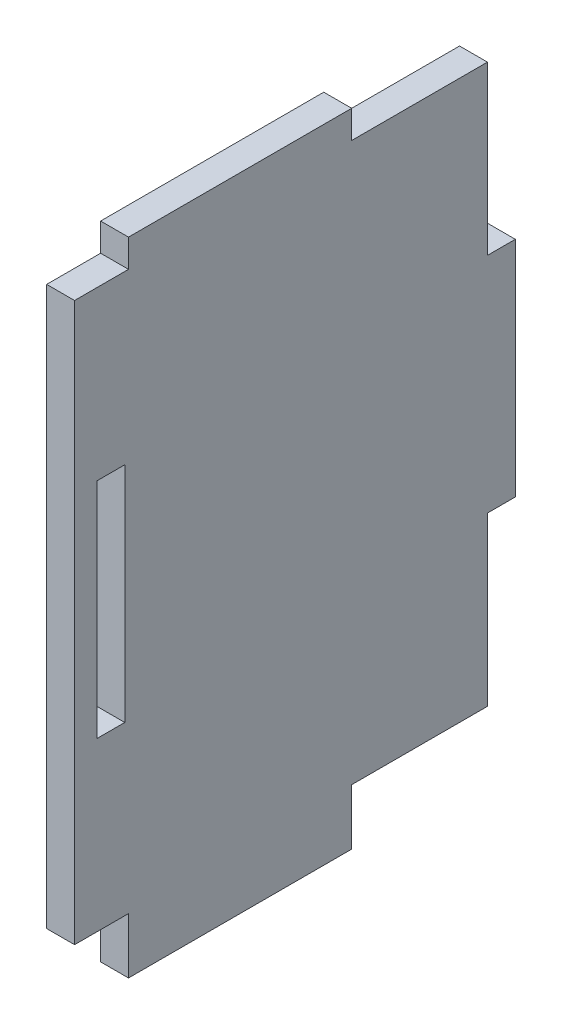
ISO-10303-21;
HEADER;
FILE_DESCRIPTION(('STEP AP214'),'2;1');
FILE_NAME('part.step','',(''),(''),'','','');
FILE_SCHEMA(('AUTOMOTIVE_DESIGN { 1 0 10303 214 1 1 1 1 }'));
ENDSEC;
DATA;
#1=APPLICATION_CONTEXT('core data for automotive mechanical design processes');
#2=APPLICATION_PROTOCOL_DEFINITION('international standard','automotive_design',2000,#1);
#3=PRODUCT_CONTEXT('',#1,'mechanical');
#4=PRODUCT('Part','Part','',(#3));
#5=PRODUCT_RELATED_PRODUCT_CATEGORY('part','',(#4));
#6=PRODUCT_DEFINITION_FORMATION('','',#4);
#7=PRODUCT_DEFINITION_CONTEXT('part definition',#1,'design');
#8=PRODUCT_DEFINITION('design','',#6,#7);
#9=PRODUCT_DEFINITION_SHAPE('','',#8);
#10=(LENGTH_UNIT() NAMED_UNIT(*) SI_UNIT(.MILLI.,.METRE.));
#11=(NAMED_UNIT(*) PLANE_ANGLE_UNIT() SI_UNIT($,.RADIAN.));
#12=(NAMED_UNIT(*) SI_UNIT($,.STERADIAN.) SOLID_ANGLE_UNIT());
#13=UNCERTAINTY_MEASURE_WITH_UNIT(LENGTH_MEASURE(1.E-05),#10,'distance_accuracy_value','');
#14=(GEOMETRIC_REPRESENTATION_CONTEXT(3) GLOBAL_UNCERTAINTY_ASSIGNED_CONTEXT((#13)) GLOBAL_UNIT_ASSIGNED_CONTEXT((#10,
#11,#12)) REPRESENTATION_CONTEXT('',''));
#15=CARTESIAN_POINT('',(0.,0.,0.));
#16=DIRECTION('',(0.,0.,1.));
#17=DIRECTION('',(1.,0.,0.));
#18=AXIS2_PLACEMENT_3D('',#15,#16,#17);
#19=CARTESIAN_POINT('',(1.25,0.,-4.83333333333335));
#20=DIRECTION('',(0.,0.,-1.));
#21=DIRECTION('',(0.,1.,0.));
#22=AXIS2_PLACEMENT_3D('',#19,#20,#21);
#23=PLANE('',#22);
#24=DIRECTION('',(0.,-1.,0.));
#25=VECTOR('',#24,1.);
#26=CARTESIAN_POINT('',(-1.25,0.,-4.83333333333335));
#27=LINE('',#26,#25);
#28=CARTESIAN_POINT('',(-1.25,5.,-4.83333333333335));
#29=VERTEX_POINT('',#28);
#30=CARTESIAN_POINT('',(-1.25,0.,-4.83333333333335));
#31=VERTEX_POINT('',#30);
#32=EDGE_CURVE('E222',#29,#31,#27,.T.);
#33=ORIENTED_EDGE('',*,*,#32,.T.);
#34=DIRECTION('',(-1.,0.,0.));
#35=VECTOR('',#34,1.);
#36=CARTESIAN_POINT('',(1.25,0.,-4.83333333333335));
#37=LINE('',#36,#35);
#38=CARTESIAN_POINT('',(1.25,0.,-4.83333333333335));
#39=VERTEX_POINT('',#38);
#40=EDGE_CURVE('E11',#39,#31,#37,.T.);
#41=ORIENTED_EDGE('',*,*,#40,.F.);
#42=DIRECTION('',(0.,-1.,0.));
#43=VECTOR('',#42,1.);
#44=CARTESIAN_POINT('',(1.25,0.,-4.83333333333335));
#45=LINE('',#44,#43);
#46=CARTESIAN_POINT('',(1.25,5.,-4.83333333333335));
#47=VERTEX_POINT('',#46);
#48=EDGE_CURVE('E392',#47,#39,#45,.T.);
#49=ORIENTED_EDGE('',*,*,#48,.F.);
#50=DIRECTION('',(-1.,0.,0.));
#51=VECTOR('',#50,1.);
#52=CARTESIAN_POINT('',(1.25,5.,-4.83333333333335));
#53=LINE('',#52,#51);
#54=EDGE_CURVE('E54',#47,#29,#53,.T.);
#55=ORIENTED_EDGE('',*,*,#54,.T.);
#56=EDGE_LOOP('',(#33,#41,#49,#55));
#57=FACE_BOUND('',#56,.T.);
#58=ADVANCED_FACE('F35',(#57),#23,.F.);
#59=CARTESIAN_POINT('',(1.25,0.,0.));
#60=DIRECTION('',(0.,1.,0.));
#61=DIRECTION('',(0.,0.,1.));
#62=AXIS2_PLACEMENT_3D('',#59,#60,#61);
#63=PLANE('',#62);
#64=DIRECTION('',(0.,0.,-1.));
#65=VECTOR('',#64,1.);
#66=CARTESIAN_POINT('',(-1.25,0.,0.));
#67=LINE('',#66,#65);
#68=CARTESIAN_POINT('',(-1.25,0.,-24.8333333333334));
#69=VERTEX_POINT('',#68);
#70=EDGE_CURVE('E224',#31,#69,#67,.T.);
#71=ORIENTED_EDGE('',*,*,#70,.T.);
#72=DIRECTION('',(-1.,0.,0.));
#73=VECTOR('',#72,1.);
#74=CARTESIAN_POINT('',(1.25,0.,-24.8333333333334));
#75=LINE('',#74,#73);
#76=CARTESIAN_POINT('',(1.25,0.,-24.8333333333334));
#77=VERTEX_POINT('',#76);
#78=EDGE_CURVE('E45',#77,#69,#75,.T.);
#79=ORIENTED_EDGE('',*,*,#78,.F.);
#80=DIRECTION('',(0.,0.,-1.));
#81=VECTOR('',#80,1.);
#82=CARTESIAN_POINT('',(1.25,0.,0.));
#83=LINE('',#82,#81);
#84=EDGE_CURVE('E394',#39,#77,#83,.T.);
#85=ORIENTED_EDGE('',*,*,#84,.F.);
#86=ORIENTED_EDGE('',*,*,#40,.T.);
#87=EDGE_LOOP('',(#71,#79,#85,#86));
#88=FACE_BOUND('',#87,.T.);
#89=ADVANCED_FACE('F322',(#88),#63,.F.);
#90=CARTESIAN_POINT('',(1.25,0.,-24.8333333333334));
#91=DIRECTION('',(0.,0.,1.));
#92=DIRECTION('',(1.,0.,0.));
#93=AXIS2_PLACEMENT_3D('',#90,#91,#92);
#94=PLANE('',#93);
#95=DIRECTION('',(0.,1.,0.));
#96=VECTOR('',#95,1.);
#97=CARTESIAN_POINT('',(-1.25,0.,-24.8333333333334));
#98=LINE('',#97,#96);
#99=CARTESIAN_POINT('',(-1.25,5.,-24.8333333333334));
#100=VERTEX_POINT('',#99);
#101=EDGE_CURVE('E226',#69,#100,#98,.T.);
#102=ORIENTED_EDGE('',*,*,#101,.T.);
#103=DIRECTION('',(-1.,0.,0.));
#104=VECTOR('',#103,1.);
#105=CARTESIAN_POINT('',(1.25,5.,-24.8333333333334));
#106=LINE('',#105,#104);
#107=CARTESIAN_POINT('',(1.25,5.,-24.8333333333334));
#108=VERTEX_POINT('',#107);
#109=EDGE_CURVE('E286',#108,#100,#106,.T.);
#110=ORIENTED_EDGE('',*,*,#109,.F.);
#111=DIRECTION('',(0.,1.,0.));
#112=VECTOR('',#111,1.);
#113=CARTESIAN_POINT('',(1.25,0.,-24.8333333333334));
#114=LINE('',#113,#112);
#115=EDGE_CURVE('E396',#77,#108,#114,.T.);
#116=ORIENTED_EDGE('',*,*,#115,.F.);
#117=ORIENTED_EDGE('',*,*,#78,.T.);
#118=EDGE_LOOP('',(#102,#110,#116,#117));
#119=FACE_BOUND('',#118,.T.);
#120=ADVANCED_FACE('F327',(#119),#94,.F.);
#121=CARTESIAN_POINT('',(1.25,5.,0.));
#122=DIRECTION('',(0.,1.,0.));
#123=DIRECTION('',(0.,0.,1.));
#124=AXIS2_PLACEMENT_3D('',#121,#122,#123);
#125=PLANE('',#124);
#126=DIRECTION('',(0.,0.,-1.));
#127=VECTOR('',#126,1.);
#128=CARTESIAN_POINT('',(-1.25,5.,0.));
#129=LINE('',#128,#127);
#130=CARTESIAN_POINT('',(-1.25,5.,-37.));
#131=VERTEX_POINT('',#130);
#132=EDGE_CURVE('E228',#100,#131,#129,.T.);
#133=ORIENTED_EDGE('',*,*,#132,.T.);
#134=DIRECTION('',(-1.,0.,0.));
#135=VECTOR('',#134,1.);
#136=CARTESIAN_POINT('',(1.25,5.,-37.));
#137=LINE('',#136,#135);
#138=CARTESIAN_POINT('',(1.25,5.,-37.));
#139=VERTEX_POINT('',#138);
#140=EDGE_CURVE('E283',#139,#131,#137,.T.);
#141=ORIENTED_EDGE('',*,*,#140,.F.);
#142=DIRECTION('',(0.,0.,-1.));
#143=VECTOR('',#142,1.);
#144=CARTESIAN_POINT('',(1.25,5.,0.));
#145=LINE('',#144,#143);
#146=EDGE_CURVE('E398',#108,#139,#145,.T.);
#147=ORIENTED_EDGE('',*,*,#146,.F.);
#148=ORIENTED_EDGE('',*,*,#109,.T.);
#149=EDGE_LOOP('',(#133,#141,#147,#148));
#150=FACE_BOUND('',#149,.T.);
#151=ADVANCED_FACE('F333',(#150),#125,.F.);
#152=CARTESIAN_POINT('',(1.25,0.,-37.));
#153=DIRECTION('',(0.,0.,1.));
#154=DIRECTION('',(1.,0.,0.));
#155=AXIS2_PLACEMENT_3D('',#152,#153,#154);
#156=PLANE('',#155);
#157=DIRECTION('',(0.,1.,0.));
#158=VECTOR('',#157,1.);
#159=CARTESIAN_POINT('',(-1.25,0.,-37.));
#160=LINE('',#159,#158);
#161=CARTESIAN_POINT('',(-1.25,20.,-37.));
#162=VERTEX_POINT('',#161);
#163=EDGE_CURVE('E230',#131,#162,#160,.T.);
#164=ORIENTED_EDGE('',*,*,#163,.T.);
#165=DIRECTION('',(-1.,0.,0.));
#166=VECTOR('',#165,1.);
#167=CARTESIAN_POINT('',(1.25,20.,-37.));
#168=LINE('',#167,#166);
#169=CARTESIAN_POINT('',(1.25,20.,-37.));
#170=VERTEX_POINT('',#169);
#171=EDGE_CURVE('E280',#170,#162,#168,.T.);
#172=ORIENTED_EDGE('',*,*,#171,.F.);
#173=DIRECTION('',(0.,1.,0.));
#174=VECTOR('',#173,1.);
#175=CARTESIAN_POINT('',(1.25,0.,-37.));
#176=LINE('',#175,#174);
#177=EDGE_CURVE('E400',#139,#170,#176,.T.);
#178=ORIENTED_EDGE('',*,*,#177,.F.);
#179=ORIENTED_EDGE('',*,*,#140,.T.);
#180=EDGE_LOOP('',(#164,#172,#178,#179));
#181=FACE_BOUND('',#180,.T.);
#182=ADVANCED_FACE('F337',(#181),#156,.F.);
#183=CARTESIAN_POINT('',(1.25,20.,0.));
#184=DIRECTION('',(0.,1.,0.));
#185=DIRECTION('',(0.,0.,1.));
#186=AXIS2_PLACEMENT_3D('',#183,#184,#185);
#187=PLANE('',#186);
#188=DIRECTION('',(0.,0.,-1.));
#189=VECTOR('',#188,1.);
#190=CARTESIAN_POINT('',(-1.25,20.,0.));
#191=LINE('',#190,#189);
#192=CARTESIAN_POINT('',(-1.25,20.,-39.5));
#193=VERTEX_POINT('',#192);
#194=EDGE_CURVE('E232',#162,#193,#191,.T.);
#195=ORIENTED_EDGE('',*,*,#194,.T.);
#196=DIRECTION('',(-1.,0.,0.));
#197=VECTOR('',#196,1.);
#198=CARTESIAN_POINT('',(1.25,20.,-39.5));
#199=LINE('',#198,#197);
#200=CARTESIAN_POINT('',(1.25,20.,-39.5));
#201=VERTEX_POINT('',#200);
#202=EDGE_CURVE('E277',#201,#193,#199,.T.);
#203=ORIENTED_EDGE('',*,*,#202,.F.);
#204=DIRECTION('',(0.,0.,-1.));
#205=VECTOR('',#204,1.);
#206=CARTESIAN_POINT('',(1.25,20.,0.));
#207=LINE('',#206,#205);
#208=EDGE_CURVE('E402',#170,#201,#207,.T.);
#209=ORIENTED_EDGE('',*,*,#208,.F.);
#210=ORIENTED_EDGE('',*,*,#171,.T.);
#211=EDGE_LOOP('',(#195,#203,#209,#210));
#212=FACE_BOUND('',#211,.T.);
#213=ADVANCED_FACE('F341',(#212),#187,.F.);
#214=CARTESIAN_POINT('',(1.25,0.,-39.5));
#215=DIRECTION('',(0.,0.,1.));
#216=DIRECTION('',(1.,0.,0.));
#217=AXIS2_PLACEMENT_3D('',#214,#215,#216);
#218=PLANE('',#217);
#219=DIRECTION('',(0.,1.,0.));
#220=VECTOR('',#219,1.);
#221=CARTESIAN_POINT('',(-1.25,0.,-39.5));
#222=LINE('',#221,#220);
#223=CARTESIAN_POINT('',(-1.25,40.,-39.5));
#224=VERTEX_POINT('',#223);
#225=EDGE_CURVE('E234',#193,#224,#222,.T.);
#226=ORIENTED_EDGE('',*,*,#225,.T.);
#227=DIRECTION('',(-1.,0.,0.));
#228=VECTOR('',#227,1.);
#229=CARTESIAN_POINT('',(1.25,40.,-39.5));
#230=LINE('',#229,#228);
#231=CARTESIAN_POINT('',(1.25,40.,-39.5));
#232=VERTEX_POINT('',#231);
#233=EDGE_CURVE('E275',#232,#224,#230,.T.);
#234=ORIENTED_EDGE('',*,*,#233,.F.);
#235=DIRECTION('',(0.,1.,0.));
#236=VECTOR('',#235,1.);
#237=CARTESIAN_POINT('',(1.25,0.,-39.5));
#238=LINE('',#237,#236);
#239=EDGE_CURVE('E404',#201,#232,#238,.T.);
#240=ORIENTED_EDGE('',*,*,#239,.F.);
#241=ORIENTED_EDGE('',*,*,#202,.T.);
#242=EDGE_LOOP('',(#226,#234,#240,#241));
#243=FACE_BOUND('',#242,.T.);
#244=ADVANCED_FACE('F345',(#243),#218,.F.);
#245=CARTESIAN_POINT('',(1.25,40.,0.));
#246=DIRECTION('',(0.,1.,0.));
#247=DIRECTION('',(0.,0.,1.));
#248=AXIS2_PLACEMENT_3D('',#245,#246,#247);
#249=PLANE('',#248);
#250=DIRECTION('',(0.,0.,-1.));
#251=VECTOR('',#250,1.);
#252=CARTESIAN_POINT('',(-1.25,40.,0.));
#253=LINE('',#252,#251);
#254=CARTESIAN_POINT('',(-1.25,40.,-37.));
#255=VERTEX_POINT('',#254);
#256=EDGE_CURVE('E237',#255,#224,#253,.T.);
#257=ORIENTED_EDGE('',*,*,#256,.F.);
#258=DIRECTION('',(-1.,0.,0.));
#259=VECTOR('',#258,1.);
#260=CARTESIAN_POINT('',(1.25,40.,-37.));
#261=LINE('',#260,#259);
#262=CARTESIAN_POINT('',(1.25,40.,-37.));
#263=VERTEX_POINT('',#262);
#264=EDGE_CURVE('E273',#263,#255,#261,.T.);
#265=ORIENTED_EDGE('',*,*,#264,.F.);
#266=DIRECTION('',(0.,0.,-1.));
#267=VECTOR('',#266,1.);
#268=CARTESIAN_POINT('',(1.25,40.,0.));
#269=LINE('',#268,#267);
#270=EDGE_CURVE('E406',#263,#232,#269,.T.);
#271=ORIENTED_EDGE('',*,*,#270,.T.);
#272=ORIENTED_EDGE('',*,*,#233,.T.);
#273=EDGE_LOOP('',(#257,#265,#271,#272));
#274=FACE_BOUND('',#273,.T.);
#275=ADVANCED_FACE('F349',(#274),#249,.T.);
#276=CARTESIAN_POINT('',(1.25,0.,-37.));
#277=DIRECTION('',(0.,0.,-1.));
#278=DIRECTION('',(-1.,0.,0.));
#279=AXIS2_PLACEMENT_3D('',#276,#277,#278);
#280=PLANE('',#279);
#281=DIRECTION('',(0.,-1.,0.));
#282=VECTOR('',#281,1.);
#283=CARTESIAN_POINT('',(-1.25,0.,-37.));
#284=LINE('',#283,#282);
#285=CARTESIAN_POINT('',(-1.25,55.,-37.));
#286=VERTEX_POINT('',#285);
#287=EDGE_CURVE('E240',#286,#255,#284,.T.);
#288=ORIENTED_EDGE('',*,*,#287,.F.);
#289=DIRECTION('',(-1.,0.,0.));
#290=VECTOR('',#289,1.);
#291=CARTESIAN_POINT('',(1.25,55.,-37.));
#292=LINE('',#291,#290);
#293=CARTESIAN_POINT('',(1.25,55.,-37.));
#294=VERTEX_POINT('',#293);
#295=EDGE_CURVE('E271',#294,#286,#292,.T.);
#296=ORIENTED_EDGE('',*,*,#295,.F.);
#297=DIRECTION('',(0.,-1.,0.));
#298=VECTOR('',#297,1.);
#299=CARTESIAN_POINT('',(1.25,0.,-37.));
#300=LINE('',#299,#298);
#301=EDGE_CURVE('E409',#294,#263,#300,.T.);
#302=ORIENTED_EDGE('',*,*,#301,.T.);
#303=ORIENTED_EDGE('',*,*,#264,.T.);
#304=EDGE_LOOP('',(#288,#296,#302,#303));
#305=FACE_BOUND('',#304,.T.);
#306=ADVANCED_FACE('F353',(#305),#280,.T.);
#307=CARTESIAN_POINT('',(1.25,55.,0.));
#308=DIRECTION('',(0.,1.,0.));
#309=DIRECTION('',(0.,0.,1.));
#310=AXIS2_PLACEMENT_3D('',#307,#308,#309);
#311=PLANE('',#310);
#312=DIRECTION('',(0.,0.,-1.));
#313=VECTOR('',#312,1.);
#314=CARTESIAN_POINT('',(-1.25,55.,0.));
#315=LINE('',#314,#313);
#316=CARTESIAN_POINT('',(-1.25,55.,-24.8333333333334));
#317=VERTEX_POINT('',#316);
#318=EDGE_CURVE('E243',#317,#286,#315,.T.);
#319=ORIENTED_EDGE('',*,*,#318,.F.);
#320=DIRECTION('',(-1.,0.,0.));
#321=VECTOR('',#320,1.);
#322=CARTESIAN_POINT('',(1.25,55.,-24.8333333333334));
#323=LINE('',#322,#321);
#324=CARTESIAN_POINT('',(1.25,55.,-24.8333333333334));
#325=VERTEX_POINT('',#324);
#326=EDGE_CURVE('E269',#325,#317,#323,.T.);
#327=ORIENTED_EDGE('',*,*,#326,.F.);
#328=DIRECTION('',(0.,0.,-1.));
#329=VECTOR('',#328,1.);
#330=CARTESIAN_POINT('',(1.25,55.,0.));
#331=LINE('',#330,#329);
#332=EDGE_CURVE('E412',#325,#294,#331,.T.);
#333=ORIENTED_EDGE('',*,*,#332,.T.);
#334=ORIENTED_EDGE('',*,*,#295,.T.);
#335=EDGE_LOOP('',(#319,#327,#333,#334));
#336=FACE_BOUND('',#335,.T.);
#337=ADVANCED_FACE('F357',(#336),#311,.T.);
#338=CARTESIAN_POINT('',(1.25,0.,-24.8333333333334));
#339=DIRECTION('',(0.,0.,-1.));
#340=DIRECTION('',(-1.,0.,0.));
#341=AXIS2_PLACEMENT_3D('',#338,#339,#340);
#342=PLANE('',#341);
#343=DIRECTION('',(0.,-1.,0.));
#344=VECTOR('',#343,1.);
#345=CARTESIAN_POINT('',(-1.25,0.,-24.8333333333334));
#346=LINE('',#345,#344);
#347=CARTESIAN_POINT('',(-1.25,57.5,-24.8333333333334));
#348=VERTEX_POINT('',#347);
#349=EDGE_CURVE('E246',#348,#317,#346,.T.);
#350=ORIENTED_EDGE('',*,*,#349,.F.);
#351=DIRECTION('',(-1.,0.,0.));
#352=VECTOR('',#351,1.);
#353=CARTESIAN_POINT('',(1.25,57.5,-24.8333333333334));
#354=LINE('',#353,#352);
#355=CARTESIAN_POINT('',(1.25,57.5,-24.8333333333334));
#356=VERTEX_POINT('',#355);
#357=EDGE_CURVE('E267',#356,#348,#354,.T.);
#358=ORIENTED_EDGE('',*,*,#357,.F.);
#359=DIRECTION('',(0.,-1.,0.));
#360=VECTOR('',#359,1.);
#361=CARTESIAN_POINT('',(1.25,0.,-24.8333333333334));
#362=LINE('',#361,#360);
#363=EDGE_CURVE('E415',#356,#325,#362,.T.);
#364=ORIENTED_EDGE('',*,*,#363,.T.);
#365=ORIENTED_EDGE('',*,*,#326,.T.);
#366=EDGE_LOOP('',(#350,#358,#364,#365));
#367=FACE_BOUND('',#366,.T.);
#368=ADVANCED_FACE('F361',(#367),#342,.T.);
#369=CARTESIAN_POINT('',(1.25,57.5,0.));
#370=DIRECTION('',(0.,1.,0.));
#371=DIRECTION('',(0.,0.,1.));
#372=AXIS2_PLACEMENT_3D('',#369,#370,#371);
#373=PLANE('',#372);
#374=DIRECTION('',(0.,0.,-1.));
#375=VECTOR('',#374,1.);
#376=CARTESIAN_POINT('',(-1.25,57.5,0.));
#377=LINE('',#376,#375);
#378=CARTESIAN_POINT('',(-1.25,57.5,-4.83333333333334));
#379=VERTEX_POINT('',#378);
#380=EDGE_CURVE('E249',#379,#348,#377,.T.);
#381=ORIENTED_EDGE('',*,*,#380,.F.);
#382=DIRECTION('',(-1.,0.,0.));
#383=VECTOR('',#382,1.);
#384=CARTESIAN_POINT('',(1.25,57.5,-4.83333333333334));
#385=LINE('',#384,#383);
#386=CARTESIAN_POINT('',(1.25,57.5,-4.83333333333334));
#387=VERTEX_POINT('',#386);
#388=EDGE_CURVE('E265',#387,#379,#385,.T.);
#389=ORIENTED_EDGE('',*,*,#388,.F.);
#390=DIRECTION('',(0.,0.,-1.));
#391=VECTOR('',#390,1.);
#392=CARTESIAN_POINT('',(1.25,57.5,0.));
#393=LINE('',#392,#391);
#394=EDGE_CURVE('E418',#387,#356,#393,.T.);
#395=ORIENTED_EDGE('',*,*,#394,.T.);
#396=ORIENTED_EDGE('',*,*,#357,.T.);
#397=EDGE_LOOP('',(#381,#389,#395,#396));
#398=FACE_BOUND('',#397,.T.);
#399=ADVANCED_FACE('F365',(#398),#373,.T.);
#400=CARTESIAN_POINT('',(1.25,0.,-4.83333333333334));
#401=DIRECTION('',(0.,0.,1.));
#402=DIRECTION('',(1.,0.,0.));
#403=AXIS2_PLACEMENT_3D('',#400,#401,#402);
#404=PLANE('',#403);
#405=DIRECTION('',(0.,1.,0.));
#406=VECTOR('',#405,1.);
#407=CARTESIAN_POINT('',(-1.25,0.,-4.83333333333334));
#408=LINE('',#407,#406);
#409=CARTESIAN_POINT('',(-1.25,55.,-4.83333333333334));
#410=VERTEX_POINT('',#409);
#411=EDGE_CURVE('E252',#410,#379,#408,.T.);
#412=ORIENTED_EDGE('',*,*,#411,.F.);
#413=DIRECTION('',(-1.,0.,0.));
#414=VECTOR('',#413,1.);
#415=CARTESIAN_POINT('',(1.25,55.,-4.83333333333334));
#416=LINE('',#415,#414);
#417=CARTESIAN_POINT('',(1.25,55.,-4.83333333333334));
#418=VERTEX_POINT('',#417);
#419=EDGE_CURVE('E201',#418,#410,#416,.T.);
#420=ORIENTED_EDGE('',*,*,#419,.F.);
#421=DIRECTION('',(0.,1.,0.));
#422=VECTOR('',#421,1.);
#423=CARTESIAN_POINT('',(1.25,0.,-4.83333333333334));
#424=LINE('',#423,#422);
#425=EDGE_CURVE('E191',#418,#387,#424,.T.);
#426=ORIENTED_EDGE('',*,*,#425,.T.);
#427=ORIENTED_EDGE('',*,*,#388,.T.);
#428=EDGE_LOOP('',(#412,#420,#426,#427));
#429=FACE_BOUND('',#428,.T.);
#430=ADVANCED_FACE('F369',(#429),#404,.T.);
#431=CARTESIAN_POINT('',(1.25,55.,0.));
#432=DIRECTION('',(0.,-1.,0.));
#433=DIRECTION('',(0.,0.,-1.));
#434=AXIS2_PLACEMENT_3D('',#431,#432,#433);
#435=PLANE('',#434);
#436=DIRECTION('',(0.,0.,1.));
#437=VECTOR('',#436,1.);
#438=CARTESIAN_POINT('',(-1.25,55.,0.));
#439=LINE('',#438,#437);
#440=CARTESIAN_POINT('',(-1.25,55.,0.));
#441=VERTEX_POINT('',#440);
#442=EDGE_CURVE('E198',#410,#441,#439,.T.);
#443=ORIENTED_EDGE('',*,*,#442,.T.);
#444=DIRECTION('',(-1.,0.,0.));
#445=VECTOR('',#444,1.);
#446=CARTESIAN_POINT('',(1.25,55.,0.));
#447=LINE('',#446,#445);
#448=CARTESIAN_POINT('',(1.25,55.,0.));
#449=VERTEX_POINT('',#448);
#450=EDGE_CURVE('E195',#449,#441,#447,.T.);
#451=ORIENTED_EDGE('',*,*,#450,.F.);
#452=DIRECTION('',(0.,0.,1.));
#453=VECTOR('',#452,1.);
#454=CARTESIAN_POINT('',(1.25,55.,0.));
#455=LINE('',#454,#453);
#456=EDGE_CURVE('E182',#418,#449,#455,.T.);
#457=ORIENTED_EDGE('',*,*,#456,.F.);
#458=ORIENTED_EDGE('',*,*,#419,.T.);
#459=EDGE_LOOP('',(#443,#451,#457,#458));
#460=FACE_BOUND('',#459,.T.);
#461=ADVANCED_FACE('F196',(#460),#435,.F.);
#462=CARTESIAN_POINT('',(1.25,0.,0.));
#463=DIRECTION('',(0.,0.,-1.));
#464=DIRECTION('',(0.,1.,0.));
#465=AXIS2_PLACEMENT_3D('',#462,#463,#464);
#466=PLANE('',#465);
#467=DIRECTION('',(0.,-1.,0.));
#468=VECTOR('',#467,1.);
#469=CARTESIAN_POINT('',(-1.25,0.,0.));
#470=LINE('',#469,#468);
#471=CARTESIAN_POINT('',(-1.25,5.,0.));
#472=VERTEX_POINT('',#471);
#473=EDGE_CURVE('E256',#441,#472,#470,.T.);
#474=ORIENTED_EDGE('',*,*,#473,.T.);
#475=DIRECTION('',(-1.,0.,0.));
#476=VECTOR('',#475,1.);
#477=CARTESIAN_POINT('',(1.25,5.,0.));
#478=LINE('',#477,#476);
#479=CARTESIAN_POINT('',(1.25,5.,0.));
#480=VERTEX_POINT('',#479);
#481=EDGE_CURVE('E117',#480,#472,#478,.T.);
#482=ORIENTED_EDGE('',*,*,#481,.F.);
#483=DIRECTION('',(0.,-1.,0.));
#484=VECTOR('',#483,1.);
#485=CARTESIAN_POINT('',(1.25,0.,0.));
#486=LINE('',#485,#484);
#487=EDGE_CURVE('E188',#449,#480,#486,.T.);
#488=ORIENTED_EDGE('',*,*,#487,.F.);
#489=ORIENTED_EDGE('',*,*,#450,.T.);
#490=EDGE_LOOP('',(#474,#482,#488,#489));
#491=FACE_BOUND('',#490,.T.);
#492=ADVANCED_FACE('F203',(#491),#466,.F.);
#493=CARTESIAN_POINT('',(1.25,20.,0.));
#494=DIRECTION('',(0.,-1.,0.));
#495=DIRECTION('',(0.,0.,-1.));
#496=AXIS2_PLACEMENT_3D('',#493,#494,#495);
#497=PLANE('',#496);
#498=DIRECTION('',(0.,0.,1.));
#499=VECTOR('',#498,1.);
#500=CARTESIAN_POINT('',(-1.25,20.,0.));
#501=LINE('',#500,#499);
#502=CARTESIAN_POINT('',(-1.25,20.,-4.50000000000001));
#503=VERTEX_POINT('',#502);
#504=CARTESIAN_POINT('',(-1.25,20.,-2.00000000000001));
#505=VERTEX_POINT('',#504);
#506=EDGE_CURVE('E210',#503,#505,#501,.T.);
#507=ORIENTED_EDGE('',*,*,#506,.T.);
#508=DIRECTION('',(-1.,0.,0.));
#509=VECTOR('',#508,1.);
#510=CARTESIAN_POINT('',(1.25,20.,-2.00000000000001));
#511=LINE('',#510,#509);
#512=CARTESIAN_POINT('',(1.25,20.,-2.00000000000001));
#513=VERTEX_POINT('',#512);
#514=EDGE_CURVE('E39',#513,#505,#511,.T.);
#515=ORIENTED_EDGE('',*,*,#514,.F.);
#516=DIRECTION('',(0.,0.,1.));
#517=VECTOR('',#516,1.);
#518=CARTESIAN_POINT('',(1.25,20.,0.));
#519=LINE('',#518,#517);
#520=CARTESIAN_POINT('',(1.25,20.,-4.50000000000001));
#521=VERTEX_POINT('',#520);
#522=EDGE_CURVE('E261',#521,#513,#519,.T.);
#523=ORIENTED_EDGE('',*,*,#522,.F.);
#524=DIRECTION('',(-1.,0.,0.));
#525=VECTOR('',#524,1.);
#526=CARTESIAN_POINT('',(1.25,20.,-4.50000000000001));
#527=LINE('',#526,#525);
#528=EDGE_CURVE('E206',#521,#503,#527,.T.);
#529=ORIENTED_EDGE('',*,*,#528,.T.);
#530=EDGE_LOOP('',(#507,#515,#523,#529));
#531=FACE_BOUND('',#530,.T.);
#532=ADVANCED_FACE('F37',(#531),#497,.F.);
#533=CARTESIAN_POINT('',(1.25,0.,-2.00000000000001));
#534=DIRECTION('',(0.,0.,1.));
#535=DIRECTION('',(1.,0.,0.));
#536=AXIS2_PLACEMENT_3D('',#533,#534,#535);
#537=PLANE('',#536);
#538=DIRECTION('',(0.,1.,0.));
#539=VECTOR('',#538,1.);
#540=CARTESIAN_POINT('',(-1.25,0.,-2.00000000000001));
#541=LINE('',#540,#539);
#542=CARTESIAN_POINT('',(-1.25,40.,-2.00000000000001));
#543=VERTEX_POINT('',#542);
#544=EDGE_CURVE('E213',#505,#543,#541,.T.);
#545=ORIENTED_EDGE('',*,*,#544,.T.);
#546=DIRECTION('',(-1.,0.,0.));
#547=VECTOR('',#546,1.);
#548=CARTESIAN_POINT('',(1.25,40.,-2.00000000000001));
#549=LINE('',#548,#547);
#550=CARTESIAN_POINT('',(1.25,40.,-2.00000000000001));
#551=VERTEX_POINT('',#550);
#552=EDGE_CURVE('E293',#551,#543,#549,.T.);
#553=ORIENTED_EDGE('',*,*,#552,.F.);
#554=DIRECTION('',(0.,1.,0.));
#555=VECTOR('',#554,1.);
#556=CARTESIAN_POINT('',(1.25,0.,-2.00000000000001));
#557=LINE('',#556,#555);
#558=EDGE_CURVE('E130',#513,#551,#557,.T.);
#559=ORIENTED_EDGE('',*,*,#558,.F.);
#560=ORIENTED_EDGE('',*,*,#514,.T.);
#561=EDGE_LOOP('',(#545,#553,#559,#560));
#562=FACE_BOUND('',#561,.T.);
#563=ADVANCED_FACE('F298',(#562),#537,.F.);
#564=CARTESIAN_POINT('',(1.25,40.,0.));
#565=DIRECTION('',(0.,-1.,0.));
#566=DIRECTION('',(0.,0.,-1.));
#567=AXIS2_PLACEMENT_3D('',#564,#565,#566);
#568=PLANE('',#567);
#569=DIRECTION('',(0.,0.,1.));
#570=VECTOR('',#569,1.);
#571=CARTESIAN_POINT('',(-1.25,40.,0.));
#572=LINE('',#571,#570);
#573=CARTESIAN_POINT('',(-1.25,40.,-4.50000000000001));
#574=VERTEX_POINT('',#573);
#575=EDGE_CURVE('E216',#574,#543,#572,.T.);
#576=ORIENTED_EDGE('',*,*,#575,.F.);
#577=DIRECTION('',(-1.,0.,0.));
#578=VECTOR('',#577,1.);
#579=CARTESIAN_POINT('',(1.25,40.,-4.50000000000001));
#580=LINE('',#579,#578);
#581=CARTESIAN_POINT('',(1.25,40.,-4.50000000000001));
#582=VERTEX_POINT('',#581);
#583=EDGE_CURVE('E292',#582,#574,#580,.T.);
#584=ORIENTED_EDGE('',*,*,#583,.F.);
#585=DIRECTION('',(0.,0.,1.));
#586=VECTOR('',#585,1.);
#587=CARTESIAN_POINT('',(1.25,40.,0.));
#588=LINE('',#587,#586);
#589=EDGE_CURVE('E387',#582,#551,#588,.T.);
#590=ORIENTED_EDGE('',*,*,#589,.T.);
#591=ORIENTED_EDGE('',*,*,#552,.T.);
#592=EDGE_LOOP('',(#576,#584,#590,#591));
#593=FACE_BOUND('',#592,.T.);
#594=ADVANCED_FACE('F312',(#593),#568,.T.);
#595=CARTESIAN_POINT('',(1.25,0.,-4.50000000000001));
#596=DIRECTION('',(0.,0.,1.));
#597=DIRECTION('',(1.,0.,0.));
#598=AXIS2_PLACEMENT_3D('',#595,#596,#597);
#599=PLANE('',#598);
#600=DIRECTION('',(0.,1.,0.));
#601=VECTOR('',#600,1.);
#602=CARTESIAN_POINT('',(-1.25,0.,-4.50000000000001));
#603=LINE('',#602,#601);
#604=EDGE_CURVE('E219',#503,#574,#603,.T.);
#605=ORIENTED_EDGE('',*,*,#604,.F.);
#606=ORIENTED_EDGE('',*,*,#528,.F.);
#607=DIRECTION('',(0.,1.,0.));
#608=VECTOR('',#607,1.);
#609=CARTESIAN_POINT('',(1.25,0.,-4.50000000000001));
#610=LINE('',#609,#608);
#611=EDGE_CURVE('E310',#521,#582,#610,.T.);
#612=ORIENTED_EDGE('',*,*,#611,.T.);
#613=ORIENTED_EDGE('',*,*,#583,.T.);
#614=EDGE_LOOP('',(#605,#606,#612,#613));
#615=FACE_BOUND('',#614,.T.);
#616=ADVANCED_FACE('F307',(#615),#599,.T.);
#617=CARTESIAN_POINT('',(1.25,5.,0.));
#618=DIRECTION('',(0.,-1.,0.));
#619=DIRECTION('',(0.,0.,-1.));
#620=AXIS2_PLACEMENT_3D('',#617,#618,#619);
#621=PLANE('',#620);
#622=DIRECTION('',(0.,0.,1.));
#623=VECTOR('',#622,1.);
#624=CARTESIAN_POINT('',(-1.25,5.,0.));
#625=LINE('',#624,#623);
#626=EDGE_CURVE('E258',#29,#472,#625,.T.);
#627=ORIENTED_EDGE('',*,*,#626,.F.);
#628=ORIENTED_EDGE('',*,*,#54,.F.);
#629=DIRECTION('',(0.,0.,1.));
#630=VECTOR('',#629,1.);
#631=CARTESIAN_POINT('',(1.25,5.,0.));
#632=LINE('',#631,#630);
#633=EDGE_CURVE('E204',#47,#480,#632,.T.);
#634=ORIENTED_EDGE('',*,*,#633,.T.);
#635=ORIENTED_EDGE('',*,*,#481,.T.);
#636=EDGE_LOOP('',(#627,#628,#634,#635));
#637=FACE_BOUND('',#636,.T.);
#638=ADVANCED_FACE('F319',(#637),#621,.T.);
#639=CARTESIAN_POINT('',(1.25,0.,0.));
#640=DIRECTION('',(1.,0.,0.));
#641=DIRECTION('',(0.,0.,-1.));
#642=AXIS2_PLACEMENT_3D('',#639,#640,#641);
#643=PLANE('',#642);
#644=ORIENTED_EDGE('',*,*,#522,.T.);
#645=ORIENTED_EDGE('',*,*,#558,.T.);
#646=ORIENTED_EDGE('',*,*,#589,.F.);
#647=ORIENTED_EDGE('',*,*,#611,.F.);
#648=EDGE_LOOP('',(#644,#645,#646,#647));
#649=FACE_BOUND('',#648,.T.);
#650=ORIENTED_EDGE('',*,*,#48,.T.);
#651=ORIENTED_EDGE('',*,*,#84,.T.);
#652=ORIENTED_EDGE('',*,*,#115,.T.);
#653=ORIENTED_EDGE('',*,*,#146,.T.);
#654=ORIENTED_EDGE('',*,*,#177,.T.);
#655=ORIENTED_EDGE('',*,*,#208,.T.);
#656=ORIENTED_EDGE('',*,*,#239,.T.);
#657=ORIENTED_EDGE('',*,*,#270,.F.);
#658=ORIENTED_EDGE('',*,*,#301,.F.);
#659=ORIENTED_EDGE('',*,*,#332,.F.);
#660=ORIENTED_EDGE('',*,*,#363,.F.);
#661=ORIENTED_EDGE('',*,*,#394,.F.);
#662=ORIENTED_EDGE('',*,*,#425,.F.);
#663=ORIENTED_EDGE('',*,*,#456,.T.);
#664=ORIENTED_EDGE('',*,*,#487,.T.);
#665=ORIENTED_EDGE('',*,*,#633,.F.);
#666=EDGE_LOOP('',(#650,#651,#652,#653,#654,#655,#656,#657,#658,#659,#660,#661,#662,#663,#664,#665));
#667=FACE_BOUND('',#666,.T.);
#668=ADVANCED_FACE('F185',(#649,#667),#643,.T.);
#669=CARTESIAN_POINT('',(-1.25,0.,0.));
#670=DIRECTION('',(1.,0.,0.));
#671=DIRECTION('',(0.,0.,-1.));
#672=AXIS2_PLACEMENT_3D('',#669,#670,#671);
#673=PLANE('',#672);
#674=ORIENTED_EDGE('',*,*,#506,.F.);
#675=ORIENTED_EDGE('',*,*,#604,.T.);
#676=ORIENTED_EDGE('',*,*,#575,.T.);
#677=ORIENTED_EDGE('',*,*,#544,.F.);
#678=EDGE_LOOP('',(#674,#675,#676,#677));
#679=FACE_BOUND('',#678,.T.);
#680=ORIENTED_EDGE('',*,*,#32,.F.);
#681=ORIENTED_EDGE('',*,*,#626,.T.);
#682=ORIENTED_EDGE('',*,*,#473,.F.);
#683=ORIENTED_EDGE('',*,*,#442,.F.);
#684=ORIENTED_EDGE('',*,*,#411,.T.);
#685=ORIENTED_EDGE('',*,*,#380,.T.);
#686=ORIENTED_EDGE('',*,*,#349,.T.);
#687=ORIENTED_EDGE('',*,*,#318,.T.);
#688=ORIENTED_EDGE('',*,*,#287,.T.);
#689=ORIENTED_EDGE('',*,*,#256,.T.);
#690=ORIENTED_EDGE('',*,*,#225,.F.);
#691=ORIENTED_EDGE('',*,*,#194,.F.);
#692=ORIENTED_EDGE('',*,*,#163,.F.);
#693=ORIENTED_EDGE('',*,*,#132,.F.);
#694=ORIENTED_EDGE('',*,*,#101,.F.);
#695=ORIENTED_EDGE('',*,*,#70,.F.);
#696=EDGE_LOOP('',(#680,#681,#682,#683,#684,#685,#686,#687,#688,#689,#690,#691,#692,#693,#694,#695));
#697=FACE_BOUND('',#696,.T.);
#698=ADVANCED_FACE('F304',(#679,#697),#673,.F.);
#699=CLOSED_SHELL('',(#58,#89,#120,#151,#182,#213,#244,#275,#306,#337,#368,#399,#430,#461,#492,
#532,#563,#594,#616,#638,#668,#698));
#700=MANIFOLD_SOLID_BREP('B2',#699);
#701=ADVANCED_BREP_SHAPE_REPRESENTATION('',(#18,#700),#14);
#702=SHAPE_DEFINITION_REPRESENTATION(#9,#701);
ENDSEC;
END-ISO-10303-21;
